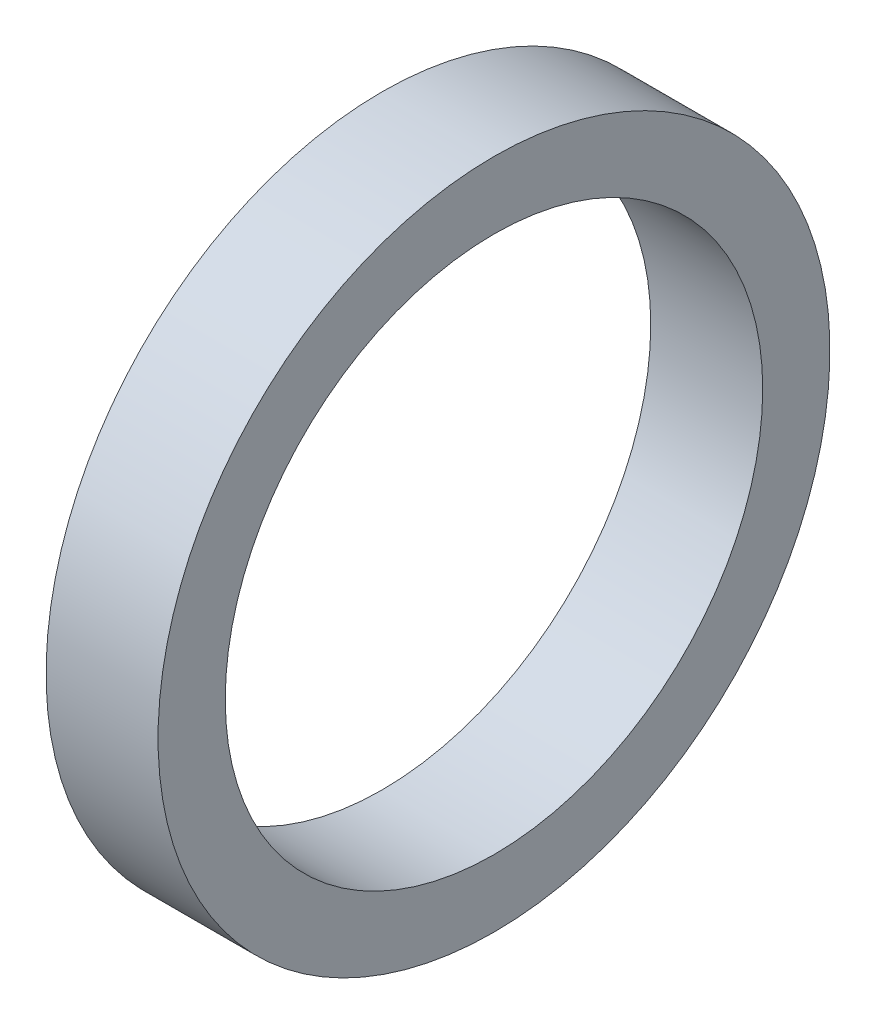
ISO-10303-21;
HEADER;
FILE_DESCRIPTION(('STEP AP214'),'2;1');
FILE_NAME('part.step','',(''),(''),'','','');
FILE_SCHEMA(('AUTOMOTIVE_DESIGN { 1 0 10303 214 1 1 1 1 }'));
ENDSEC;
DATA;
#1=APPLICATION_CONTEXT('core data for automotive mechanical design processes');
#2=APPLICATION_PROTOCOL_DEFINITION('international standard','automotive_design',2000,#1);
#3=PRODUCT_CONTEXT('',#1,'mechanical');
#4=PRODUCT('Part','Part','',(#3));
#5=PRODUCT_RELATED_PRODUCT_CATEGORY('part','',(#4));
#6=PRODUCT_DEFINITION_FORMATION('','',#4);
#7=PRODUCT_DEFINITION_CONTEXT('part definition',#1,'design');
#8=PRODUCT_DEFINITION('design','',#6,#7);
#9=PRODUCT_DEFINITION_SHAPE('','',#8);
#10=(LENGTH_UNIT() NAMED_UNIT(*) SI_UNIT(.MILLI.,.METRE.));
#11=(NAMED_UNIT(*) PLANE_ANGLE_UNIT() SI_UNIT($,.RADIAN.));
#12=(NAMED_UNIT(*) SI_UNIT($,.STERADIAN.) SOLID_ANGLE_UNIT());
#13=UNCERTAINTY_MEASURE_WITH_UNIT(LENGTH_MEASURE(1.E-05),#10,'distance_accuracy_value','');
#14=(GEOMETRIC_REPRESENTATION_CONTEXT(3) GLOBAL_UNCERTAINTY_ASSIGNED_CONTEXT((#13)) GLOBAL_UNIT_ASSIGNED_CONTEXT((#10,
#11,#12)) REPRESENTATION_CONTEXT('',''));
#15=CARTESIAN_POINT('',(0.,0.,0.));
#16=DIRECTION('',(0.,0.,1.));
#17=DIRECTION('',(1.,0.,0.));
#18=AXIS2_PLACEMENT_3D('',#15,#16,#17);
#19=CARTESIAN_POINT('',(0.,0.,0.));
#20=DIRECTION('',(1.,0.,0.));
#21=DIRECTION('',(0.,1.,0.));
#22=AXIS2_PLACEMENT_3D('',#19,#20,#21);
#23=PLANE('',#22);
#24=CARTESIAN_POINT('',(0.,0.,0.));
#25=DIRECTION('',(-1.,0.,0.));
#26=DIRECTION('',(0.,-1.,0.));
#27=AXIS2_PLACEMENT_3D('',#24,#25,#26);
#28=CIRCLE('',#27,24.);
#29=CARTESIAN_POINT('',(0.,24.,0.));
#30=VERTEX_POINT('',#29);
#31=EDGE_CURVE('E49',#30,#30,#28,.T.);
#32=ORIENTED_EDGE('',*,*,#31,.F.);
#33=EDGE_LOOP('',(#32));
#34=FACE_BOUND('',#33,.T.);
#35=CARTESIAN_POINT('',(0.,0.,0.));
#36=DIRECTION('',(1.,0.,0.));
#37=DIRECTION('',(0.,1.,0.));
#38=AXIS2_PLACEMENT_3D('',#35,#36,#37);
#39=CIRCLE('',#38,30.);
#40=CARTESIAN_POINT('',(0.,-30.,0.));
#41=VERTEX_POINT('',#40);
#42=EDGE_CURVE('E11',#41,#41,#39,.T.);
#43=ORIENTED_EDGE('',*,*,#42,.F.);
#44=EDGE_LOOP('',(#43));
#45=FACE_BOUND('',#44,.T.);
#46=ADVANCED_FACE('F17',(#34,#45),#23,.F.);
#47=CARTESIAN_POINT('',(10.,0.,0.));
#48=DIRECTION('',(1.,0.,0.));
#49=DIRECTION('',(0.,1.,0.));
#50=AXIS2_PLACEMENT_3D('',#47,#48,#49);
#51=PLANE('',#50);
#52=CARTESIAN_POINT('',(10.,0.,0.));
#53=DIRECTION('',(-1.,0.,0.));
#54=DIRECTION('',(0.,-1.,0.));
#55=AXIS2_PLACEMENT_3D('',#52,#53,#54);
#56=CIRCLE('',#55,24.);
#57=CARTESIAN_POINT('',(10.,24.,0.));
#58=VERTEX_POINT('',#57);
#59=EDGE_CURVE('E56',#58,#58,#56,.T.);
#60=ORIENTED_EDGE('',*,*,#59,.T.);
#61=EDGE_LOOP('',(#60));
#62=FACE_BOUND('',#61,.T.);
#63=CARTESIAN_POINT('',(10.,0.,0.));
#64=DIRECTION('',(1.,0.,0.));
#65=DIRECTION('',(0.,1.,0.));
#66=AXIS2_PLACEMENT_3D('',#63,#64,#65);
#67=CIRCLE('',#66,30.);
#68=CARTESIAN_POINT('',(10.,-30.,0.));
#69=VERTEX_POINT('',#68);
#70=EDGE_CURVE('E67',#69,#69,#67,.T.);
#71=ORIENTED_EDGE('',*,*,#70,.T.);
#72=EDGE_LOOP('',(#71));
#73=FACE_BOUND('',#72,.T.);
#74=ADVANCED_FACE('F59',(#62,#73),#51,.T.);
#75=CARTESIAN_POINT('',(0.,0.,0.));
#76=DIRECTION('',(1.,0.,0.));
#77=DIRECTION('',(0.,1.,0.));
#78=AXIS2_PLACEMENT_3D('',#75,#76,#77);
#79=CYLINDRICAL_SURFACE('',#78,30.);
#80=ORIENTED_EDGE('',*,*,#70,.F.);
#81=DIRECTION('',(-1.,0.,0.));
#82=VECTOR('',#81,1.);
#83=CARTESIAN_POINT('',(0.,-30.,0.));
#84=LINE('',#83,#82);
#85=EDGE_CURVE('E27',#69,#41,#84,.T.);
#86=ORIENTED_EDGE('',*,*,#85,.T.);
#87=ORIENTED_EDGE('',*,*,#42,.T.);
#88=ORIENTED_EDGE('',*,*,#85,.F.);
#89=EDGE_LOOP('',(#80,#86,#87,#88));
#90=FACE_BOUND('',#89,.T.);
#91=ADVANCED_FACE('F74',(#90),#79,.T.);
#92=CARTESIAN_POINT('',(0.,0.,0.));
#93=DIRECTION('',(1.,0.,0.));
#94=DIRECTION('',(0.,-1.,0.));
#95=AXIS2_PLACEMENT_3D('',#92,#93,#94);
#96=CYLINDRICAL_SURFACE('',#95,24.);
#97=ORIENTED_EDGE('',*,*,#59,.F.);
#98=DIRECTION('',(-1.,0.,0.));
#99=VECTOR('',#98,1.);
#100=CARTESIAN_POINT('',(0.,24.,0.));
#101=LINE('',#100,#99);
#102=EDGE_CURVE('E20',#58,#30,#101,.T.);
#103=ORIENTED_EDGE('',*,*,#102,.T.);
#104=ORIENTED_EDGE('',*,*,#31,.T.);
#105=ORIENTED_EDGE('',*,*,#102,.F.);
#106=EDGE_LOOP('',(#97,#103,#104,#105));
#107=FACE_BOUND('',#106,.T.);
#108=ADVANCED_FACE('F55',(#107),#96,.F.);
#109=CLOSED_SHELL('',(#46,#74,#91,#108));
#110=MANIFOLD_SOLID_BREP('B1',#109);
#111=ADVANCED_BREP_SHAPE_REPRESENTATION('',(#18,#110),#14);
#112=SHAPE_DEFINITION_REPRESENTATION(#9,#111);
ENDSEC;
END-ISO-10303-21;
